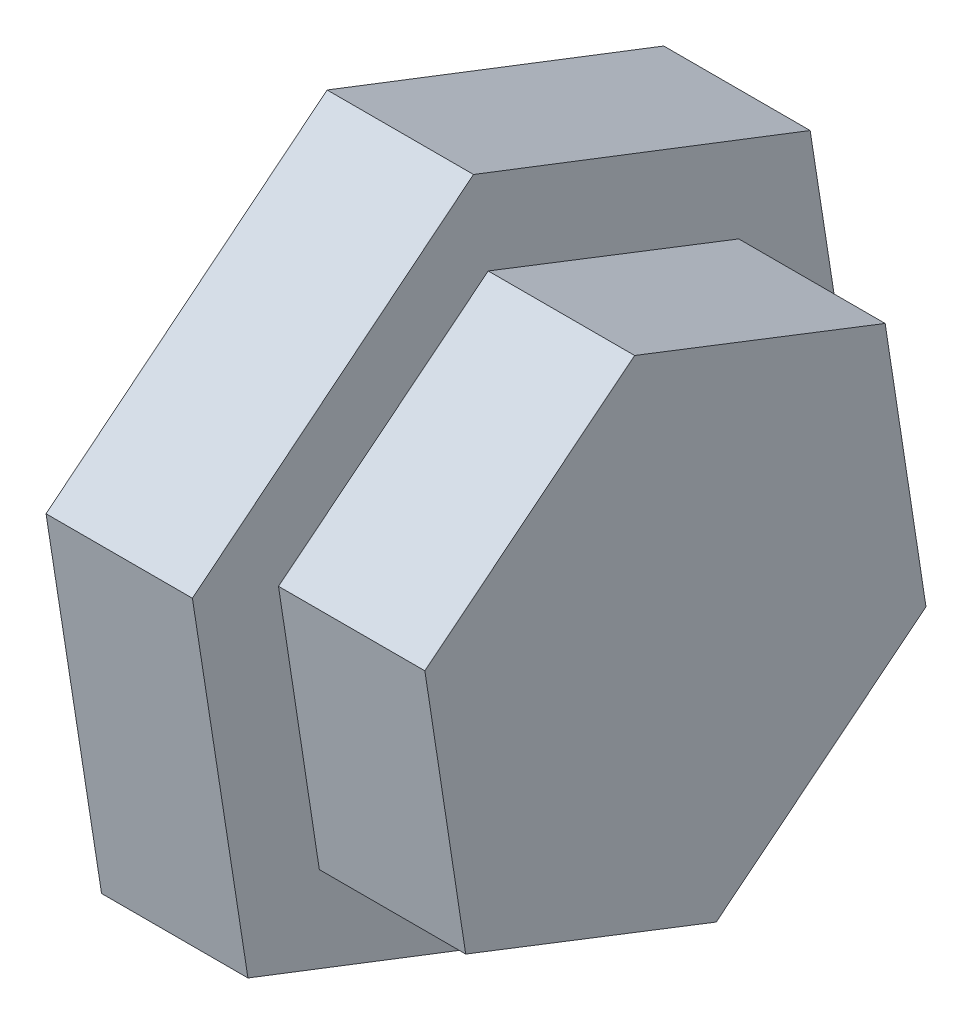
ISO-10303-21;
HEADER;
FILE_DESCRIPTION(('STEP AP214'),'2;1');
FILE_NAME('part.step','',(''),(''),'','','');
FILE_SCHEMA(('AUTOMOTIVE_DESIGN { 1 0 10303 214 1 1 1 1 }'));
ENDSEC;
DATA;
#1=APPLICATION_CONTEXT('core data for automotive mechanical design processes');
#2=APPLICATION_PROTOCOL_DEFINITION('international standard','automotive_design',2000,#1);
#3=PRODUCT_CONTEXT('',#1,'mechanical');
#4=PRODUCT('Part','Part','',(#3));
#5=PRODUCT_RELATED_PRODUCT_CATEGORY('part','',(#4));
#6=PRODUCT_DEFINITION_FORMATION('','',#4);
#7=PRODUCT_DEFINITION_CONTEXT('part definition',#1,'design');
#8=PRODUCT_DEFINITION('design','',#6,#7);
#9=PRODUCT_DEFINITION_SHAPE('','',#8);
#10=(LENGTH_UNIT() NAMED_UNIT(*) SI_UNIT(.MILLI.,.METRE.));
#11=(NAMED_UNIT(*) PLANE_ANGLE_UNIT() SI_UNIT($,.RADIAN.));
#12=(NAMED_UNIT(*) SI_UNIT($,.STERADIAN.) SOLID_ANGLE_UNIT());
#13=UNCERTAINTY_MEASURE_WITH_UNIT(LENGTH_MEASURE(1.E-05),#10,'distance_accuracy_value','');
#14=(GEOMETRIC_REPRESENTATION_CONTEXT(3) GLOBAL_UNCERTAINTY_ASSIGNED_CONTEXT((#13)) GLOBAL_UNIT_ASSIGNED_CONTEXT((#10,
#11,#12)) REPRESENTATION_CONTEXT('',''));
#15=CARTESIAN_POINT('',(0.,0.,0.));
#16=DIRECTION('',(0.,0.,1.));
#17=DIRECTION('',(1.,0.,0.));
#18=AXIS2_PLACEMENT_3D('',#15,#16,#17);
#19=CARTESIAN_POINT('',(0.5,-0.773432149846822,0.960240101718636));
#20=DIRECTION('',(0.,0.93263871459617,-0.360811624031717));
#21=DIRECTION('',(0.,0.360811624031717,0.93263871459617));
#22=AXIS2_PLACEMENT_3D('',#19,#20,#21);
#23=PLANE('',#22);
#24=DIRECTION('',(0.,-0.360811624031716,-0.93263871459617));
#25=VECTOR('',#24,1.);
#26=CARTESIAN_POINT('',(0.,-0.773432149846822,0.960240101718636));
#27=LINE('',#26,#25);
#28=CARTESIAN_POINT('',(0.,-0.773432149846822,0.960240101718636));
#29=VERTEX_POINT('',#28);
#30=CARTESIAN_POINT('',(0.,-1.2183083967443,-0.189691839011642));
#31=VERTEX_POINT('',#30);
#32=EDGE_CURVE('E141',#29,#31,#27,.T.);
#33=ORIENTED_EDGE('',*,*,#32,.T.);
#34=DIRECTION('',(-1.,0.,0.));
#35=VECTOR('',#34,1.);
#36=CARTESIAN_POINT('',(0.5,-1.2183083967443,-0.189691839011642));
#37=LINE('',#36,#35);
#38=CARTESIAN_POINT('',(0.5,-1.2183083967443,-0.189691839011642));
#39=VERTEX_POINT('',#38);
#40=EDGE_CURVE('E11',#39,#31,#37,.T.);
#41=ORIENTED_EDGE('',*,*,#40,.F.);
#42=DIRECTION('',(0.,-0.360811624031716,-0.93263871459617));
#43=VECTOR('',#42,1.);
#44=CARTESIAN_POINT('',(0.5,-0.773432149846822,0.960240101718636));
#45=LINE('',#44,#43);
#46=CARTESIAN_POINT('',(0.5,-0.773432149846822,0.960240101718636));
#47=VERTEX_POINT('',#46);
#48=EDGE_CURVE('E150',#47,#39,#45,.T.);
#49=ORIENTED_EDGE('',*,*,#48,.F.);
#50=DIRECTION('',(-1.,0.,0.));
#51=VECTOR('',#50,1.);
#52=CARTESIAN_POINT('',(0.5,-0.773432149846822,0.960240101718636));
#53=LINE('',#52,#51);
#54=EDGE_CURVE('E163',#47,#29,#53,.T.);
#55=ORIENTED_EDGE('',*,*,#54,.T.);
#56=EDGE_LOOP('',(#33,#41,#49,#55));
#57=FACE_BOUND('',#56,.T.);
#58=ADVANCED_FACE('F33',(#57),#23,.F.);
#59=CARTESIAN_POINT('',(0.5,-1.2183083967443,-0.189691839011642));
#60=DIRECTION('',(0.,0.778791389690271,0.62728300737729));
#61=DIRECTION('',(0.,-0.62728300737729,0.778791389690271));
#62=AXIS2_PLACEMENT_3D('',#59,#60,#61);
#63=PLANE('',#62);
#64=DIRECTION('',(0.,0.62728300737729,-0.778791389690271));
#65=VECTOR('',#64,1.);
#66=CARTESIAN_POINT('',(0.,-1.2183083967443,-0.189691839011642));
#67=LINE('',#66,#65);
#68=CARTESIAN_POINT('',(0.,-0.444876246897481,-1.14993194073028));
#69=VERTEX_POINT('',#68);
#70=EDGE_CURVE('E144',#31,#69,#67,.T.);
#71=ORIENTED_EDGE('',*,*,#70,.T.);
#72=DIRECTION('',(-1.,0.,0.));
#73=VECTOR('',#72,1.);
#74=CARTESIAN_POINT('',(0.5,-0.444876246897481,-1.14993194073028));
#75=LINE('',#74,#73);
#76=CARTESIAN_POINT('',(0.5,-0.444876246897481,-1.14993194073028));
#77=VERTEX_POINT('',#76);
#78=EDGE_CURVE('E40',#77,#69,#75,.T.);
#79=ORIENTED_EDGE('',*,*,#78,.F.);
#80=DIRECTION('',(0.,0.62728300737729,-0.778791389690271));
#81=VECTOR('',#80,1.);
#82=CARTESIAN_POINT('',(0.5,-1.2183083967443,-0.189691839011642));
#83=LINE('',#82,#81);
#84=EDGE_CURVE('E153',#39,#77,#83,.T.);
#85=ORIENTED_EDGE('',*,*,#84,.F.);
#86=ORIENTED_EDGE('',*,*,#40,.T.);
#87=EDGE_LOOP('',(#71,#79,#85,#86));
#88=FACE_BOUND('',#87,.T.);
#89=ADVANCED_FACE('F211',(#88),#63,.F.);
#90=CARTESIAN_POINT('',(0.5,-0.444876246897481,-1.14993194073028));
#91=DIRECTION('',(0.,-0.153847324905899,0.988094631409006));
#92=DIRECTION('',(0.,-0.988094631409006,-0.153847324905899));
#93=AXIS2_PLACEMENT_3D('',#90,#91,#92);
#94=PLANE('',#93);
#95=DIRECTION('',(0.,0.988094631409006,0.153847324905899));
#96=VECTOR('',#95,1.);
#97=CARTESIAN_POINT('',(0.,-0.444876246897481,-1.14993194073028));
#98=LINE('',#97,#96);
#99=CARTESIAN_POINT('',(0.,0.773432149846822,-0.960240101718635));
#100=VERTEX_POINT('',#99);
#101=EDGE_CURVE('E166',#69,#100,#98,.T.);
#102=ORIENTED_EDGE('',*,*,#101,.T.);
#103=DIRECTION('',(-1.,0.,0.));
#104=VECTOR('',#103,1.);
#105=CARTESIAN_POINT('',(0.5,0.773432149846822,-0.960240101718635));
#106=LINE('',#105,#104);
#107=CARTESIAN_POINT('',(0.5,0.773432149846822,-0.960240101718635));
#108=VERTEX_POINT('',#107);
#109=EDGE_CURVE('E181',#108,#100,#106,.T.);
#110=ORIENTED_EDGE('',*,*,#109,.F.);
#111=DIRECTION('',(0.,0.988094631409006,0.153847324905899));
#112=VECTOR('',#111,1.);
#113=CARTESIAN_POINT('',(0.5,-0.444876246897481,-1.14993194073028));
#114=LINE('',#113,#112);
#115=EDGE_CURVE('E156',#77,#108,#114,.T.);
#116=ORIENTED_EDGE('',*,*,#115,.F.);
#117=ORIENTED_EDGE('',*,*,#78,.T.);
#118=EDGE_LOOP('',(#102,#110,#116,#117));
#119=FACE_BOUND('',#118,.T.);
#120=ADVANCED_FACE('F188',(#119),#94,.F.);
#121=CARTESIAN_POINT('',(0.5,0.773432149846822,-0.960240101718635));
#122=DIRECTION('',(0.,-0.93263871459617,0.360811624031716));
#123=DIRECTION('',(0.,-0.360811624031716,-0.93263871459617));
#124=AXIS2_PLACEMENT_3D('',#121,#122,#123);
#125=PLANE('',#124);
#126=DIRECTION('',(0.,0.360811624031716,0.93263871459617));
#127=VECTOR('',#126,1.);
#128=CARTESIAN_POINT('',(0.,0.773432149846822,-0.960240101718635));
#129=LINE('',#128,#127);
#130=CARTESIAN_POINT('',(0.,1.2183083967443,0.189691839011642));
#131=VERTEX_POINT('',#130);
#132=EDGE_CURVE('E168',#100,#131,#129,.T.);
#133=ORIENTED_EDGE('',*,*,#132,.T.);
#134=DIRECTION('',(-1.,0.,0.));
#135=VECTOR('',#134,1.);
#136=CARTESIAN_POINT('',(0.5,1.2183083967443,0.189691839011642));
#137=LINE('',#136,#135);
#138=CARTESIAN_POINT('',(0.5,1.2183083967443,0.189691839011642));
#139=VERTEX_POINT('',#138);
#140=EDGE_CURVE('E178',#139,#131,#137,.T.);
#141=ORIENTED_EDGE('',*,*,#140,.F.);
#142=DIRECTION('',(0.,0.360811624031716,0.93263871459617));
#143=VECTOR('',#142,1.);
#144=CARTESIAN_POINT('',(0.5,0.773432149846822,-0.960240101718635));
#145=LINE('',#144,#143);
#146=EDGE_CURVE('E158',#108,#139,#145,.T.);
#147=ORIENTED_EDGE('',*,*,#146,.F.);
#148=ORIENTED_EDGE('',*,*,#109,.T.);
#149=EDGE_LOOP('',(#133,#141,#147,#148));
#150=FACE_BOUND('',#149,.T.);
#151=ADVANCED_FACE('F199',(#150),#125,.F.);
#152=CARTESIAN_POINT('',(0.5,1.2183083967443,0.189691839011642));
#153=DIRECTION('',(0.,-0.778791389690271,-0.627283007377289));
#154=DIRECTION('',(0.,0.627283007377289,-0.778791389690271));
#155=AXIS2_PLACEMENT_3D('',#152,#153,#154);
#156=PLANE('',#155);
#157=DIRECTION('',(0.,-0.627283007377289,0.778791389690271));
#158=VECTOR('',#157,1.);
#159=CARTESIAN_POINT('',(0.,1.2183083967443,0.189691839011642));
#160=LINE('',#159,#158);
#161=CARTESIAN_POINT('',(0.,0.444876246897481,1.14993194073028));
#162=VERTEX_POINT('',#161);
#163=EDGE_CURVE('E170',#131,#162,#160,.T.);
#164=ORIENTED_EDGE('',*,*,#163,.T.);
#165=DIRECTION('',(-1.,0.,0.));
#166=VECTOR('',#165,1.);
#167=CARTESIAN_POINT('',(0.5,0.444876246897481,1.14993194073028));
#168=LINE('',#167,#166);
#169=CARTESIAN_POINT('',(0.5,0.444876246897481,1.14993194073028));
#170=VERTEX_POINT('',#169);
#171=EDGE_CURVE('E175',#170,#162,#168,.T.);
#172=ORIENTED_EDGE('',*,*,#171,.F.);
#173=DIRECTION('',(0.,-0.627283007377289,0.778791389690271));
#174=VECTOR('',#173,1.);
#175=CARTESIAN_POINT('',(0.5,1.2183083967443,0.189691839011642));
#176=LINE('',#175,#174);
#177=EDGE_CURVE('E160',#139,#170,#176,.T.);
#178=ORIENTED_EDGE('',*,*,#177,.F.);
#179=ORIENTED_EDGE('',*,*,#140,.T.);
#180=EDGE_LOOP('',(#164,#172,#178,#179));
#181=FACE_BOUND('',#180,.T.);
#182=ADVANCED_FACE('F203',(#181),#156,.F.);
#183=CARTESIAN_POINT('',(0.5,0.444876246897481,1.14993194073028));
#184=DIRECTION('',(0.,0.153847324905899,-0.988094631409006));
#185=DIRECTION('',(0.,0.988094631409006,0.153847324905899));
#186=AXIS2_PLACEMENT_3D('',#183,#184,#185);
#187=PLANE('',#186);
#188=DIRECTION('',(0.,-0.988094631409006,-0.153847324905899));
#189=VECTOR('',#188,1.);
#190=CARTESIAN_POINT('',(0.,0.444876246897481,1.14993194073028));
#191=LINE('',#190,#189);
#192=EDGE_CURVE('E154',#162,#29,#191,.T.);
#193=ORIENTED_EDGE('',*,*,#192,.T.);
#194=ORIENTED_EDGE('',*,*,#54,.F.);
#195=DIRECTION('',(0.,-0.988094631409006,-0.153847324905899));
#196=VECTOR('',#195,1.);
#197=CARTESIAN_POINT('',(0.5,0.444876246897481,1.14993194073028));
#198=LINE('',#197,#196);
#199=EDGE_CURVE('E162',#170,#47,#198,.T.);
#200=ORIENTED_EDGE('',*,*,#199,.F.);
#201=ORIENTED_EDGE('',*,*,#171,.T.);
#202=EDGE_LOOP('',(#193,#194,#200,#201));
#203=FACE_BOUND('',#202,.T.);
#204=ADVANCED_FACE('F214',(#203),#187,.F.);
#205=CARTESIAN_POINT('',(0.5,0.,0.));
#206=DIRECTION('',(1.,0.,0.));
#207=DIRECTION('',(0.,0.,-1.));
#208=AXIS2_PLACEMENT_3D('',#205,#206,#207);
#209=PLANE('',#208);
#210=DIRECTION('',(0.,-0.362736749147649,-0.931891651866136));
#211=VECTOR('',#210,1.);
#212=CARTESIAN_POINT('',(0.5,-0.574617383718667,0.716428714499173));
#213=LINE('',#212,#211);
#214=CARTESIAN_POINT('',(0.5,-0.574617383718667,0.716428714499173));
#215=VERTEX_POINT('',#214);
#216=CARTESIAN_POINT('',(0.5,-0.907754158616247,-0.13941889450693));
#217=VERTEX_POINT('',#216);
#218=EDGE_CURVE('E47',#215,#217,#213,.T.);
#219=ORIENTED_EDGE('',*,*,#218,.F.);
#220=DIRECTION('',(0.,-0.988410218664542,-0.151806586285021));
#221=VECTOR('',#220,1.);
#222=CARTESIAN_POINT('',(0.5,0.333136774897579,0.855847609006103));
#223=LINE('',#222,#221);
#224=CARTESIAN_POINT('',(0.5,0.333136774897579,0.855847609006103));
#225=VERTEX_POINT('',#224);
#226=EDGE_CURVE('E51',#225,#215,#223,.T.);
#227=ORIENTED_EDGE('',*,*,#226,.F.);
#228=DIRECTION('',(0.,-0.625673469516893,0.780085065581115));
#229=VECTOR('',#228,1.);
#230=CARTESIAN_POINT('',(0.5,0.907754158616247,0.13941889450693));
#231=LINE('',#230,#229);
#232=CARTESIAN_POINT('',(0.5,0.907754158616247,0.13941889450693));
#233=VERTEX_POINT('',#232);
#234=EDGE_CURVE('E331',#233,#225,#231,.T.);
#235=ORIENTED_EDGE('',*,*,#234,.F.);
#236=DIRECTION('',(0.,0.362736749147649,0.931891651866136));
#237=VECTOR('',#236,1.);
#238=CARTESIAN_POINT('',(0.5,0.574617383718668,-0.716428714499173));
#239=LINE('',#238,#237);
#240=CARTESIAN_POINT('',(0.5,0.574617383718668,-0.716428714499173));
#241=VERTEX_POINT('',#240);
#242=EDGE_CURVE('E346',#241,#233,#239,.T.);
#243=ORIENTED_EDGE('',*,*,#242,.F.);
#244=DIRECTION('',(0.,0.988410218664542,0.151806586285021));
#245=VECTOR('',#244,1.);
#246=CARTESIAN_POINT('',(0.5,-0.333136774897579,-0.855847609006103));
#247=LINE('',#246,#245);
#248=CARTESIAN_POINT('',(0.5,-0.333136774897579,-0.855847609006103));
#249=VERTEX_POINT('',#248);
#250=EDGE_CURVE('E349',#249,#241,#247,.T.);
#251=ORIENTED_EDGE('',*,*,#250,.F.);
#252=DIRECTION('',(0.,0.625673469516893,-0.780085065581115));
#253=VECTOR('',#252,1.);
#254=CARTESIAN_POINT('',(0.5,-0.907754158616247,-0.13941889450693));
#255=LINE('',#254,#253);
#256=EDGE_CURVE('E350',#217,#249,#255,.T.);
#257=ORIENTED_EDGE('',*,*,#256,.F.);
#258=EDGE_LOOP('',(#219,#227,#235,#243,#251,#257));
#259=FACE_BOUND('',#258,.T.);
#260=ORIENTED_EDGE('',*,*,#48,.T.);
#261=ORIENTED_EDGE('',*,*,#84,.T.);
#262=ORIENTED_EDGE('',*,*,#115,.T.);
#263=ORIENTED_EDGE('',*,*,#146,.T.);
#264=ORIENTED_EDGE('',*,*,#177,.T.);
#265=ORIENTED_EDGE('',*,*,#199,.T.);
#266=EDGE_LOOP('',(#260,#261,#262,#263,#264,#265));
#267=FACE_BOUND('',#266,.T.);
#268=ADVANCED_FACE('F207',(#259,#267),#209,.T.);
#269=CARTESIAN_POINT('',(0.,0.,0.));
#270=DIRECTION('',(1.,0.,0.));
#271=DIRECTION('',(0.,0.,-1.));
#272=AXIS2_PLACEMENT_3D('',#269,#270,#271);
#273=PLANE('',#272);
#274=ORIENTED_EDGE('',*,*,#32,.F.);
#275=ORIENTED_EDGE('',*,*,#192,.F.);
#276=ORIENTED_EDGE('',*,*,#163,.F.);
#277=ORIENTED_EDGE('',*,*,#132,.F.);
#278=ORIENTED_EDGE('',*,*,#101,.F.);
#279=ORIENTED_EDGE('',*,*,#70,.F.);
#280=EDGE_LOOP('',(#274,#275,#276,#277,#278,#279));
#281=FACE_BOUND('',#280,.T.);
#282=ADVANCED_FACE('F194',(#281),#273,.F.);
#283=CARTESIAN_POINT('',(1.,-0.574617383718667,0.716428714499173));
#284=DIRECTION('',(0.,0.931891651866136,-0.362736749147649));
#285=DIRECTION('',(0.,0.362736749147649,0.931891651866136));
#286=AXIS2_PLACEMENT_3D('',#283,#284,#285);
#287=PLANE('',#286);
#288=ORIENTED_EDGE('',*,*,#218,.T.);
#289=DIRECTION('',(-1.,0.,0.));
#290=VECTOR('',#289,1.);
#291=CARTESIAN_POINT('',(1.,-0.907754158616247,-0.13941889450693));
#292=LINE('',#291,#290);
#293=CARTESIAN_POINT('',(1.,-0.907754158616247,-0.13941889450693));
#294=VERTEX_POINT('',#293);
#295=EDGE_CURVE('E124',#294,#217,#292,.T.);
#296=ORIENTED_EDGE('',*,*,#295,.F.);
#297=DIRECTION('',(0.,-0.362736749147649,-0.931891651866136));
#298=VECTOR('',#297,1.);
#299=CARTESIAN_POINT('',(1.,-0.574617383718667,0.716428714499173));
#300=LINE('',#299,#298);
#301=CARTESIAN_POINT('',(1.,-0.574617383718667,0.716428714499173));
#302=VERTEX_POINT('',#301);
#303=EDGE_CURVE('E130',#302,#294,#300,.T.);
#304=ORIENTED_EDGE('',*,*,#303,.F.);
#305=DIRECTION('',(-1.,0.,0.));
#306=VECTOR('',#305,1.);
#307=CARTESIAN_POINT('',(1.,-0.574617383718667,0.716428714499173));
#308=LINE('',#307,#306);
#309=EDGE_CURVE('E328',#302,#215,#308,.T.);
#310=ORIENTED_EDGE('',*,*,#309,.T.);
#311=EDGE_LOOP('',(#288,#296,#304,#310));
#312=FACE_BOUND('',#311,.T.);
#313=ADVANCED_FACE('F140',(#312),#287,.F.);
#314=CARTESIAN_POINT('',(1.,-0.907754158616247,-0.13941889450693));
#315=DIRECTION('',(0.,0.780085065581115,0.625673469516894));
#316=DIRECTION('',(0.,-0.625673469516894,0.780085065581115));
#317=AXIS2_PLACEMENT_3D('',#314,#315,#316);
#318=PLANE('',#317);
#319=ORIENTED_EDGE('',*,*,#256,.T.);
#320=DIRECTION('',(-1.,0.,0.));
#321=VECTOR('',#320,1.);
#322=CARTESIAN_POINT('',(1.,-0.333136774897579,-0.855847609006103));
#323=LINE('',#322,#321);
#324=CARTESIAN_POINT('',(1.,-0.333136774897579,-0.855847609006103));
#325=VERTEX_POINT('',#324);
#326=EDGE_CURVE('E126',#325,#249,#323,.T.);
#327=ORIENTED_EDGE('',*,*,#326,.F.);
#328=DIRECTION('',(0.,0.625673469516893,-0.780085065581115));
#329=VECTOR('',#328,1.);
#330=CARTESIAN_POINT('',(1.,-0.907754158616247,-0.13941889450693));
#331=LINE('',#330,#329);
#332=EDGE_CURVE('E119',#294,#325,#331,.T.);
#333=ORIENTED_EDGE('',*,*,#332,.F.);
#334=ORIENTED_EDGE('',*,*,#295,.T.);
#335=EDGE_LOOP('',(#319,#327,#333,#334));
#336=FACE_BOUND('',#335,.T.);
#337=ADVANCED_FACE('F122',(#336),#318,.F.);
#338=CARTESIAN_POINT('',(1.,-0.333136774897579,-0.855847609006103));
#339=DIRECTION('',(0.,-0.151806586285021,0.988410218664542));
#340=DIRECTION('',(0.,-0.988410218664542,-0.151806586285021));
#341=AXIS2_PLACEMENT_3D('',#338,#339,#340);
#342=PLANE('',#341);
#343=ORIENTED_EDGE('',*,*,#250,.T.);
#344=DIRECTION('',(-1.,0.,0.));
#345=VECTOR('',#344,1.);
#346=CARTESIAN_POINT('',(1.,0.574617383718668,-0.716428714499173));
#347=LINE('',#346,#345);
#348=CARTESIAN_POINT('',(1.,0.574617383718668,-0.716428714499173));
#349=VERTEX_POINT('',#348);
#350=EDGE_CURVE('E146',#349,#241,#347,.T.);
#351=ORIENTED_EDGE('',*,*,#350,.F.);
#352=DIRECTION('',(0.,0.988410218664542,0.151806586285021));
#353=VECTOR('',#352,1.);
#354=CARTESIAN_POINT('',(1.,-0.333136774897579,-0.855847609006103));
#355=LINE('',#354,#353);
#356=EDGE_CURVE('E129',#325,#349,#355,.T.);
#357=ORIENTED_EDGE('',*,*,#356,.F.);
#358=ORIENTED_EDGE('',*,*,#326,.T.);
#359=EDGE_LOOP('',(#343,#351,#357,#358));
#360=FACE_BOUND('',#359,.T.);
#361=ADVANCED_FACE('F276',(#360),#342,.F.);
#362=CARTESIAN_POINT('',(1.,0.574617383718668,-0.716428714499173));
#363=DIRECTION('',(0.,-0.931891651866136,0.362736749147649));
#364=DIRECTION('',(0.,-0.362736749147649,-0.931891651866136));
#365=AXIS2_PLACEMENT_3D('',#362,#363,#364);
#366=PLANE('',#365);
#367=ORIENTED_EDGE('',*,*,#242,.T.);
#368=DIRECTION('',(-1.,0.,0.));
#369=VECTOR('',#368,1.);
#370=CARTESIAN_POINT('',(1.,0.907754158616247,0.13941889450693));
#371=LINE('',#370,#369);
#372=CARTESIAN_POINT('',(1.,0.907754158616247,0.13941889450693));
#373=VERTEX_POINT('',#372);
#374=EDGE_CURVE('E334',#373,#233,#371,.T.);
#375=ORIENTED_EDGE('',*,*,#374,.F.);
#376=DIRECTION('',(0.,0.362736749147649,0.931891651866136));
#377=VECTOR('',#376,1.);
#378=CARTESIAN_POINT('',(1.,0.574617383718668,-0.716428714499173));
#379=LINE('',#378,#377);
#380=EDGE_CURVE('E347',#349,#373,#379,.T.);
#381=ORIENTED_EDGE('',*,*,#380,.F.);
#382=ORIENTED_EDGE('',*,*,#350,.T.);
#383=EDGE_LOOP('',(#367,#375,#381,#382));
#384=FACE_BOUND('',#383,.T.);
#385=ADVANCED_FACE('F285',(#384),#366,.F.);
#386=CARTESIAN_POINT('',(1.,0.907754158616247,0.13941889450693));
#387=DIRECTION('',(0.,-0.780085065581115,-0.625673469516893));
#388=DIRECTION('',(0.,0.625673469516893,-0.780085065581115));
#389=AXIS2_PLACEMENT_3D('',#386,#387,#388);
#390=PLANE('',#389);
#391=ORIENTED_EDGE('',*,*,#234,.T.);
#392=DIRECTION('',(-1.,0.,0.));
#393=VECTOR('',#392,1.);
#394=CARTESIAN_POINT('',(1.,0.333136774897579,0.855847609006103));
#395=LINE('',#394,#393);
#396=CARTESIAN_POINT('',(1.,0.333136774897579,0.855847609006103));
#397=VERTEX_POINT('',#396);
#398=EDGE_CURVE('E330',#397,#225,#395,.T.);
#399=ORIENTED_EDGE('',*,*,#398,.F.);
#400=DIRECTION('',(0.,-0.625673469516893,0.780085065581115));
#401=VECTOR('',#400,1.);
#402=CARTESIAN_POINT('',(1.,0.907754158616247,0.13941889450693));
#403=LINE('',#402,#401);
#404=EDGE_CURVE('E336',#373,#397,#403,.T.);
#405=ORIENTED_EDGE('',*,*,#404,.F.);
#406=ORIENTED_EDGE('',*,*,#374,.T.);
#407=EDGE_LOOP('',(#391,#399,#405,#406));
#408=FACE_BOUND('',#407,.T.);
#409=ADVANCED_FACE('F295',(#408),#390,.F.);
#410=CARTESIAN_POINT('',(1.,0.333136774897579,0.855847609006103));
#411=DIRECTION('',(0.,0.151806586285021,-0.988410218664543));
#412=DIRECTION('',(0.,0.988410218664543,0.151806586285021));
#413=AXIS2_PLACEMENT_3D('',#410,#411,#412);
#414=PLANE('',#413);
#415=ORIENTED_EDGE('',*,*,#226,.T.);
#416=ORIENTED_EDGE('',*,*,#309,.F.);
#417=DIRECTION('',(0.,-0.988410218664542,-0.151806586285021));
#418=VECTOR('',#417,1.);
#419=CARTESIAN_POINT('',(1.,0.333136774897579,0.855847609006103));
#420=LINE('',#419,#418);
#421=EDGE_CURVE('E135',#397,#302,#420,.T.);
#422=ORIENTED_EDGE('',*,*,#421,.F.);
#423=ORIENTED_EDGE('',*,*,#398,.T.);
#424=EDGE_LOOP('',(#415,#416,#422,#423));
#425=FACE_BOUND('',#424,.T.);
#426=ADVANCED_FACE('F305',(#425),#414,.F.);
#427=CARTESIAN_POINT('',(1.,0.,0.));
#428=DIRECTION('',(1.,0.,0.));
#429=DIRECTION('',(0.,0.,-1.));
#430=AXIS2_PLACEMENT_3D('',#427,#428,#429);
#431=PLANE('',#430);
#432=ORIENTED_EDGE('',*,*,#303,.T.);
#433=ORIENTED_EDGE('',*,*,#332,.T.);
#434=ORIENTED_EDGE('',*,*,#356,.T.);
#435=ORIENTED_EDGE('',*,*,#380,.T.);
#436=ORIENTED_EDGE('',*,*,#404,.T.);
#437=ORIENTED_EDGE('',*,*,#421,.T.);
#438=EDGE_LOOP('',(#432,#433,#434,#435,#436,#437));
#439=FACE_BOUND('',#438,.T.);
#440=ADVANCED_FACE('F133',(#439),#431,.T.);
#441=CLOSED_SHELL('',(#58,#89,#120,#151,#182,#204,#268,#282,#313,#337,#361,#385,#409,#426,#440));
#442=MANIFOLD_SOLID_BREP('B2',#441);
#443=ADVANCED_BREP_SHAPE_REPRESENTATION('',(#18,#442),#14);
#444=SHAPE_DEFINITION_REPRESENTATION(#9,#443);
ENDSEC;
END-ISO-10303-21;
